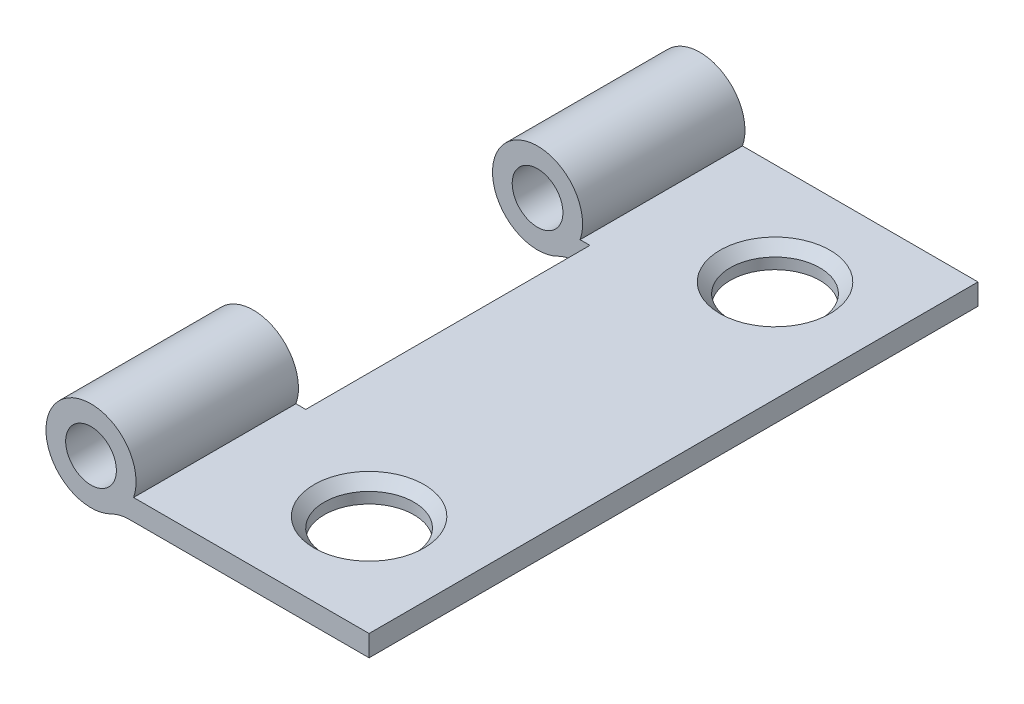
ISO-10303-21;
HEADER;
FILE_DESCRIPTION(('STEP AP214'),'2;1');
FILE_NAME('part.step','',(''),(''),'','','');
FILE_SCHEMA(('AUTOMOTIVE_DESIGN { 1 0 10303 214 1 1 1 1 }'));
ENDSEC;
DATA;
#1=APPLICATION_CONTEXT('core data for automotive mechanical design processes');
#2=APPLICATION_PROTOCOL_DEFINITION('international standard','automotive_design',2000,#1);
#3=PRODUCT_CONTEXT('',#1,'mechanical');
#4=PRODUCT('Part','Part','',(#3));
#5=PRODUCT_RELATED_PRODUCT_CATEGORY('part','',(#4));
#6=PRODUCT_DEFINITION_FORMATION('','',#4);
#7=PRODUCT_DEFINITION_CONTEXT('part definition',#1,'design');
#8=PRODUCT_DEFINITION('design','',#6,#7);
#9=PRODUCT_DEFINITION_SHAPE('','',#8);
#10=(LENGTH_UNIT() NAMED_UNIT(*) SI_UNIT(.MILLI.,.METRE.));
#11=(NAMED_UNIT(*) PLANE_ANGLE_UNIT() SI_UNIT($,.RADIAN.));
#12=(NAMED_UNIT(*) SI_UNIT($,.STERADIAN.) SOLID_ANGLE_UNIT());
#13=UNCERTAINTY_MEASURE_WITH_UNIT(LENGTH_MEASURE(1.E-05),#10,'distance_accuracy_value','');
#14=(GEOMETRIC_REPRESENTATION_CONTEXT(3) GLOBAL_UNCERTAINTY_ASSIGNED_CONTEXT((#13)) GLOBAL_UNIT_ASSIGNED_CONTEXT((#10,
#11,#12)) REPRESENTATION_CONTEXT('',''));
#15=CARTESIAN_POINT('',(0.,0.,0.));
#16=DIRECTION('',(0.,0.,1.));
#17=DIRECTION('',(1.,0.,0.));
#18=AXIS2_PLACEMENT_3D('',#15,#16,#17);
#19=CARTESIAN_POINT('',(0.,0.,19.05));
#20=DIRECTION('',(0.,0.,-1.));
#21=DIRECTION('',(-1.,0.,0.));
#22=AXIS2_PLACEMENT_3D('',#19,#20,#21);
#23=CYLINDRICAL_SURFACE('',#22,2.8194);
#24=CARTESIAN_POINT('',(0.,0.,8.89));
#25=DIRECTION('',(0.,0.,-1.));
#26=DIRECTION('',(-1.,0.,0.));
#27=AXIS2_PLACEMENT_3D('',#24,#25,#26);
#28=CIRCLE('',#27,2.8194);
#29=CARTESIAN_POINT('',(1.26684619394999,-2.51875308056872,8.89));
#30=VERTEX_POINT('',#29);
#31=CARTESIAN_POINT('',(2.66261186619455,-0.927100000000002,8.89));
#32=VERTEX_POINT('',#31);
#33=EDGE_CURVE('E135',#30,#32,#28,.T.);
#34=ORIENTED_EDGE('',*,*,#33,.F.);
#35=DIRECTION('',(0.,0.,-1.));
#36=VECTOR('',#35,1.);
#37=CARTESIAN_POINT('',(1.26684619394999,-2.51875308056872,19.05));
#38=LINE('',#37,#36);
#39=CARTESIAN_POINT('',(1.26684619394999,-2.51875308056872,19.05));
#40=VERTEX_POINT('',#39);
#41=EDGE_CURVE('E62',#30,#40,#38,.F.);
#42=ORIENTED_EDGE('',*,*,#41,.T.);
#43=CARTESIAN_POINT('',(0.,0.,19.05));
#44=DIRECTION('',(0.,0.,1.));
#45=DIRECTION('',(1.,0.,0.));
#46=AXIS2_PLACEMENT_3D('',#43,#44,#45);
#47=CIRCLE('',#46,2.8194);
#48=CARTESIAN_POINT('',(2.66261186619455,-0.9271,19.05));
#49=VERTEX_POINT('',#48);
#50=EDGE_CURVE('E189',#49,#40,#47,.T.);
#51=ORIENTED_EDGE('',*,*,#50,.F.);
#52=DIRECTION('',(0.,0.,-1.));
#53=VECTOR('',#52,1.);
#54=CARTESIAN_POINT('',(2.66261186619455,-0.927100000000002,34.8027168521072));
#55=LINE('',#54,#53);
#56=EDGE_CURVE('E176',#49,#32,#55,.T.);
#57=ORIENTED_EDGE('',*,*,#56,.T.);
#58=EDGE_LOOP('',(#34,#42,#51,#57));
#59=FACE_BOUND('',#58,.T.);
#60=ADVANCED_FACE('F37',(#59),#23,.T.);
#61=CARTESIAN_POINT('',(0.,0.,19.05));
#62=DIRECTION('',(0.,0.,-1.));
#63=DIRECTION('',(-1.,0.,0.));
#64=AXIS2_PLACEMENT_3D('',#61,#62,#63);
#65=CYLINDRICAL_SURFACE('',#64,1.5875);
#66=CARTESIAN_POINT('',(0.,0.,19.05));
#67=DIRECTION('',(0.,0.,1.));
#68=DIRECTION('',(1.,0.,0.));
#69=AXIS2_PLACEMENT_3D('',#66,#67,#68);
#70=CIRCLE('',#69,1.5875);
#71=CARTESIAN_POINT('',(-1.5875,0.,19.05));
#72=VERTEX_POINT('',#71);
#73=EDGE_CURVE('E183',#72,#72,#70,.T.);
#74=CARTESIAN_POINT('',(0.,0.,8.89));
#75=DIRECTION('',(0.,0.,-1.));
#76=DIRECTION('',(-1.,0.,0.));
#77=AXIS2_PLACEMENT_3D('',#74,#75,#76);
#78=CIRCLE('',#77,1.5875);
#79=CARTESIAN_POINT('',(-1.5875,0.,8.89));
#80=VERTEX_POINT('',#79);
#81=EDGE_CURVE('E141',#80,#80,#78,.T.);
#82=CARTESIAN_POINT('',(-1.5875,0.,19.05));
#83=CARTESIAN_POINT('',(-1.5875,0.,18.9441666666667));
#84=CARTESIAN_POINT('',(-1.5875,0.,18.8383333333333));
#85=CARTESIAN_POINT('',(-1.5875,0.,18.6266666666667));
#86=CARTESIAN_POINT('',(-1.5875,0.,18.5208333333333));
#87=CARTESIAN_POINT('',(-1.5875,0.,18.3091666666667));
#88=CARTESIAN_POINT('',(-1.5875,0.,18.2033333333333));
#89=CARTESIAN_POINT('',(-1.5875,0.,17.9916666666667));
#90=CARTESIAN_POINT('',(-1.5875,0.,17.8858333333333));
#91=CARTESIAN_POINT('',(-1.5875,0.,17.6741666666667));
#92=CARTESIAN_POINT('',(-1.5875,0.,17.5683333333333));
#93=CARTESIAN_POINT('',(-1.5875,0.,17.3566666666667));
#94=CARTESIAN_POINT('',(-1.5875,0.,17.2508333333333));
#95=CARTESIAN_POINT('',(-1.5875,0.,17.0391666666667));
#96=CARTESIAN_POINT('',(-1.5875,0.,16.9333333333333));
#97=CARTESIAN_POINT('',(-1.5875,0.,16.7216666666667));
#98=CARTESIAN_POINT('',(-1.5875,0.,16.6158333333333));
#99=CARTESIAN_POINT('',(-1.5875,0.,16.4041666666667));
#100=CARTESIAN_POINT('',(-1.5875,0.,16.2983333333333));
#101=CARTESIAN_POINT('',(-1.5875,0.,16.0866666666667));
#102=CARTESIAN_POINT('',(-1.5875,0.,15.9808333333333));
#103=CARTESIAN_POINT('',(-1.5875,0.,15.7691666666667));
#104=CARTESIAN_POINT('',(-1.5875,0.,15.6633333333333));
#105=CARTESIAN_POINT('',(-1.5875,0.,15.4516666666667));
#106=CARTESIAN_POINT('',(-1.5875,0.,15.3458333333333));
#107=CARTESIAN_POINT('',(-1.5875,0.,15.1341666666667));
#108=CARTESIAN_POINT('',(-1.5875,0.,15.0283333333333));
#109=CARTESIAN_POINT('',(-1.5875,0.,14.8166666666667));
#110=CARTESIAN_POINT('',(-1.5875,0.,14.7108333333333));
#111=CARTESIAN_POINT('',(-1.5875,0.,14.4991666666667));
#112=CARTESIAN_POINT('',(-1.5875,0.,14.3933333333333));
#113=CARTESIAN_POINT('',(-1.5875,0.,14.1816666666667));
#114=CARTESIAN_POINT('',(-1.5875,0.,14.0758333333333));
#115=CARTESIAN_POINT('',(-1.5875,0.,13.8641666666667));
#116=CARTESIAN_POINT('',(-1.5875,0.,13.7583333333333));
#117=CARTESIAN_POINT('',(-1.5875,0.,13.5466666666667));
#118=CARTESIAN_POINT('',(-1.5875,0.,13.4408333333333));
#119=CARTESIAN_POINT('',(-1.5875,0.,13.2291666666667));
#120=CARTESIAN_POINT('',(-1.5875,0.,13.1233333333333));
#121=CARTESIAN_POINT('',(-1.5875,0.,12.9116666666667));
#122=CARTESIAN_POINT('',(-1.5875,0.,12.8058333333333));
#123=CARTESIAN_POINT('',(-1.5875,0.,12.5941666666667));
#124=CARTESIAN_POINT('',(-1.5875,0.,12.4883333333333));
#125=CARTESIAN_POINT('',(-1.5875,0.,12.2766666666667));
#126=CARTESIAN_POINT('',(-1.5875,0.,12.1708333333333));
#127=CARTESIAN_POINT('',(-1.5875,0.,11.9591666666667));
#128=CARTESIAN_POINT('',(-1.5875,0.,11.8533333333333));
#129=CARTESIAN_POINT('',(-1.5875,0.,11.6416666666667));
#130=CARTESIAN_POINT('',(-1.5875,0.,11.5358333333333));
#131=CARTESIAN_POINT('',(-1.5875,0.,11.3241666666667));
#132=CARTESIAN_POINT('',(-1.5875,0.,11.2183333333333));
#133=CARTESIAN_POINT('',(-1.5875,0.,11.0066666666667));
#134=CARTESIAN_POINT('',(-1.5875,0.,10.9008333333333));
#135=CARTESIAN_POINT('',(-1.5875,0.,10.6891666666667));
#136=CARTESIAN_POINT('',(-1.5875,0.,10.5833333333333));
#137=CARTESIAN_POINT('',(-1.5875,0.,10.3716666666667));
#138=CARTESIAN_POINT('',(-1.5875,0.,10.2658333333333));
#139=CARTESIAN_POINT('',(-1.5875,0.,10.0541666666667));
#140=CARTESIAN_POINT('',(-1.5875,0.,9.94833333333333));
#141=CARTESIAN_POINT('',(-1.5875,0.,9.73666666666667));
#142=CARTESIAN_POINT('',(-1.5875,0.,9.63083333333333));
#143=CARTESIAN_POINT('',(-1.5875,0.,9.41916666666667));
#144=CARTESIAN_POINT('',(-1.5875,0.,9.31333333333333));
#145=CARTESIAN_POINT('',(-1.5875,0.,9.10166666666667));
#146=CARTESIAN_POINT('',(-1.5875,0.,8.99583333333333));
#147=CARTESIAN_POINT('',(-1.5875,0.,8.89));
#148=B_SPLINE_CURVE_WITH_KNOTS('',3,(#82,#83,#84,#85,#86,#87,#88,#89,#90,#91,#92,#93,#94,#95,
#96,#97,#98,#99,#100,#101,#102,#103,#104,#105,#106,#107,#108,#109,#110,#111,#112,#113,#114,#115,
#116,#117,#118,#119,#120,#121,#122,#123,#124,#125,#126,#127,#128,#129,#130,#131,#132,#133,#134,
#135,#136,#137,#138,#139,#140,#141,#142,#143,#144,#145,#146,#147),.UNSPECIFIED.,.F.,.F.,(4,2,2,
2,2,2,2,2,2,2,2,2,2,2,2,2,2,2,2,2,2,2,2,2,2,2,2,2,2,2,2,2,4),(0.,0.317499999999998,
0.634999999999997,0.952499999999998,1.27,1.5875,1.905,2.2225,2.54,2.8575,3.175,3.4925,3.81,
4.1275,4.445,4.7625,5.08,5.3975,5.715,6.0325,6.35,6.6675,6.985,7.3025,7.62,7.9375,8.255,8.5725,
8.89,9.2075,9.525,9.8425,10.16),.UNSPECIFIED.);
#149=EDGE_CURVE('BSEAM261',#72,#80,#148,.T.);
#150=ORIENTED_EDGE('',*,*,#73,.T.);
#151=ORIENTED_EDGE('',*,*,#81,.T.);
#152=ORIENTED_EDGE('',*,*,#149,.T.);
#153=ORIENTED_EDGE('',*,*,#149,.F.);
#154=EDGE_LOOP('',(#150,#152,#151,#153));
#155=FACE_BOUND('',#154,.T.);
#156=ADVANCED_FACE('F261',(#155),#65,.F.);
#157=CARTESIAN_POINT('',(2.40814907138242,-4.7879,19.05));
#158=DIRECTION('',(0.,0.,-1.));
#159=DIRECTION('',(-1.,0.,0.));
#160=AXIS2_PLACEMENT_3D('',#157,#158,#159);
#161=CYLINDRICAL_SURFACE('',#160,2.54);
#162=CARTESIAN_POINT('',(2.40814907138242,-4.7879,8.89));
#163=DIRECTION('',(0.,0.,-1.));
#164=DIRECTION('',(-1.,0.,0.));
#165=AXIS2_PLACEMENT_3D('',#162,#163,#164);
#166=CIRCLE('',#165,2.54);
#167=CARTESIAN_POINT('',(2.40814907138242,-2.2479,8.89));
#168=VERTEX_POINT('',#167);
#169=EDGE_CURVE('E202',#168,#30,#166,.F.);
#170=ORIENTED_EDGE('',*,*,#169,.F.);
#171=DIRECTION('',(0.,0.,1.));
#172=VECTOR('',#171,1.);
#173=CARTESIAN_POINT('',(2.40814907138242,-2.2479,-19.05));
#174=LINE('',#173,#172);
#175=CARTESIAN_POINT('',(2.40814907138242,-2.2479,19.05));
#176=VERTEX_POINT('',#175);
#177=EDGE_CURVE('E134',#176,#168,#174,.F.);
#178=ORIENTED_EDGE('',*,*,#177,.F.);
#179=CARTESIAN_POINT('',(2.40814907138242,-4.7879,19.05));
#180=DIRECTION('',(0.,0.,1.));
#181=DIRECTION('',(1.,0.,0.));
#182=AXIS2_PLACEMENT_3D('',#179,#180,#181);
#183=CIRCLE('',#182,2.54);
#184=EDGE_CURVE('E200',#40,#176,#183,.F.);
#185=ORIENTED_EDGE('',*,*,#184,.F.);
#186=ORIENTED_EDGE('',*,*,#41,.F.);
#187=EDGE_LOOP('',(#170,#178,#185,#186));
#188=FACE_BOUND('',#187,.T.);
#189=ADVANCED_FACE('F258',(#188),#161,.F.);
#190=CARTESIAN_POINT('',(1.26684619394999,-2.51875308056872,-19.05));
#191=VERTEX_POINT('',#190);
#192=CARTESIAN_POINT('',(1.26684619394999,-2.51875308056872,-8.89));
#193=VERTEX_POINT('',#192);
#194=EDGE_CURVE('E195',#191,#193,#38,.F.);
#195=ORIENTED_EDGE('',*,*,#194,.T.);
#196=CARTESIAN_POINT('',(0.,0.,-8.89));
#197=DIRECTION('',(0.,0.,-1.));
#198=DIRECTION('',(-1.,0.,0.));
#199=AXIS2_PLACEMENT_3D('',#196,#197,#198);
#200=CIRCLE('',#199,2.8194);
#201=CARTESIAN_POINT('',(2.66261186619455,-0.927100000000002,-8.89));
#202=VERTEX_POINT('',#201);
#203=EDGE_CURVE('E146',#193,#202,#200,.T.);
#204=ORIENTED_EDGE('',*,*,#203,.T.);
#205=CARTESIAN_POINT('',(2.66261186619455,-0.927100000000002,-19.05));
#206=VERTEX_POINT('',#205);
#207=EDGE_CURVE('E179',#202,#206,#55,.T.);
#208=ORIENTED_EDGE('',*,*,#207,.T.);
#209=CARTESIAN_POINT('',(0.,0.,-19.05));
#210=DIRECTION('',(0.,0.,1.));
#211=DIRECTION('',(1.,0.,0.));
#212=AXIS2_PLACEMENT_3D('',#209,#210,#211);
#213=CIRCLE('',#212,2.8194);
#214=EDGE_CURVE('E186',#206,#191,#213,.T.);
#215=ORIENTED_EDGE('',*,*,#214,.T.);
#216=EDGE_LOOP('',(#195,#204,#208,#215));
#217=FACE_BOUND('',#216,.T.);
#218=ADVANCED_FACE('F237',(#217),#23,.T.);
#219=CARTESIAN_POINT('',(0.,0.,19.05));
#220=DIRECTION('',(0.,0.,1.));
#221=DIRECTION('',(1.,0.,0.));
#222=AXIS2_PLACEMENT_3D('',#219,#220,#221);
#223=PLANE('',#222);
#224=ORIENTED_EDGE('',*,*,#50,.T.);
#225=ORIENTED_EDGE('',*,*,#184,.T.);
#226=DIRECTION('',(1.,0.,0.));
#227=VECTOR('',#226,1.);
#228=CARTESIAN_POINT('',(1.7017526112805,-2.2479,19.05));
#229=LINE('',#228,#227);
#230=CARTESIAN_POINT('',(17.399,-2.2479,19.05));
#231=VERTEX_POINT('',#230);
#232=EDGE_CURVE('E174',#176,#231,#229,.T.);
#233=ORIENTED_EDGE('',*,*,#232,.T.);
#234=DIRECTION('',(0.,1.,0.));
#235=VECTOR('',#234,1.);
#236=CARTESIAN_POINT('',(17.399,-0.9271,19.05));
#237=LINE('',#236,#235);
#238=CARTESIAN_POINT('',(17.399,-0.9271,19.05));
#239=VERTEX_POINT('',#238);
#240=EDGE_CURVE('E171',#231,#239,#237,.T.);
#241=ORIENTED_EDGE('',*,*,#240,.T.);
#242=DIRECTION('',(-1.,0.,0.));
#243=VECTOR('',#242,1.);
#244=CARTESIAN_POINT('',(2.66261186619455,-0.9271,19.05));
#245=LINE('',#244,#243);
#246=EDGE_CURVE('E167',#239,#49,#245,.T.);
#247=ORIENTED_EDGE('',*,*,#246,.T.);
#248=EDGE_LOOP('',(#224,#225,#233,#241,#247));
#249=FACE_BOUND('',#248,.T.);
#250=ORIENTED_EDGE('',*,*,#73,.F.);
#251=EDGE_LOOP('',(#250));
#252=FACE_BOUND('',#251,.T.);
#253=ADVANCED_FACE('F254',(#249,#252),#223,.T.);
#254=CARTESIAN_POINT('',(0.,0.,-19.05));
#255=DIRECTION('',(0.,0.,1.));
#256=DIRECTION('',(1.,0.,0.));
#257=AXIS2_PLACEMENT_3D('',#254,#255,#256);
#258=PLANE('',#257);
#259=ORIENTED_EDGE('',*,*,#214,.F.);
#260=DIRECTION('',(1.,0.,0.));
#261=VECTOR('',#260,1.);
#262=CARTESIAN_POINT('',(2.66261186619455,-0.9271,-19.05));
#263=LINE('',#262,#261);
#264=CARTESIAN_POINT('',(17.399,-0.9271,-19.05));
#265=VERTEX_POINT('',#264);
#266=EDGE_CURVE('E163',#206,#265,#263,.T.);
#267=ORIENTED_EDGE('',*,*,#266,.T.);
#268=DIRECTION('',(0.,-1.,0.));
#269=VECTOR('',#268,1.);
#270=CARTESIAN_POINT('',(17.399,-0.9271,-19.05));
#271=LINE('',#270,#269);
#272=CARTESIAN_POINT('',(17.399,-2.2479,-19.05));
#273=VERTEX_POINT('',#272);
#274=EDGE_CURVE('E160',#265,#273,#271,.T.);
#275=ORIENTED_EDGE('',*,*,#274,.T.);
#276=DIRECTION('',(-1.,0.,0.));
#277=VECTOR('',#276,1.);
#278=CARTESIAN_POINT('',(1.7017526112805,-2.2479,-19.05));
#279=LINE('',#278,#277);
#280=CARTESIAN_POINT('',(2.40814907138242,-2.2479,-19.05));
#281=VERTEX_POINT('',#280);
#282=EDGE_CURVE('E157',#273,#281,#279,.T.);
#283=ORIENTED_EDGE('',*,*,#282,.T.);
#284=CARTESIAN_POINT('',(2.40814907138242,-4.7879,-19.05));
#285=DIRECTION('',(0.,0.,1.));
#286=DIRECTION('',(1.,0.,0.));
#287=AXIS2_PLACEMENT_3D('',#284,#285,#286);
#288=CIRCLE('',#287,2.54);
#289=EDGE_CURVE('E198',#281,#191,#288,.T.);
#290=ORIENTED_EDGE('',*,*,#289,.T.);
#291=EDGE_LOOP('',(#259,#267,#275,#283,#290));
#292=FACE_BOUND('',#291,.T.);
#293=CARTESIAN_POINT('',(0.,0.,-19.05));
#294=DIRECTION('',(0.,0.,1.));
#295=DIRECTION('',(1.,0.,0.));
#296=AXIS2_PLACEMENT_3D('',#293,#294,#295);
#297=CIRCLE('',#296,1.5875);
#298=CARTESIAN_POINT('',(-1.5875,0.,-19.05));
#299=VERTEX_POINT('',#298);
#300=EDGE_CURVE('E170',#299,#299,#297,.T.);
#301=ORIENTED_EDGE('',*,*,#300,.T.);
#302=EDGE_LOOP('',(#301));
#303=FACE_BOUND('',#302,.T.);
#304=ADVANCED_FACE('F240',(#292,#303),#258,.F.);
#305=CARTESIAN_POINT('',(0.,0.,-8.89));
#306=DIRECTION('',(0.,0.,-1.));
#307=DIRECTION('',(-1.,0.,0.));
#308=AXIS2_PLACEMENT_3D('',#305,#306,#307);
#309=CIRCLE('',#308,1.5875);
#310=CARTESIAN_POINT('',(-1.5875,0.,-8.89));
#311=VERTEX_POINT('',#310);
#312=EDGE_CURVE('E152',#311,#311,#309,.T.);
#313=CARTESIAN_POINT('',(-1.5875,0.,-8.89));
#314=CARTESIAN_POINT('',(-1.5875,0.,-8.99583333333333));
#315=CARTESIAN_POINT('',(-1.5875,0.,-9.10166666666666));
#316=CARTESIAN_POINT('',(-1.5875,0.,-9.31333333333333));
#317=CARTESIAN_POINT('',(-1.5875,0.,-9.41916666666666));
#318=CARTESIAN_POINT('',(-1.5875,0.,-9.63083333333333));
#319=CARTESIAN_POINT('',(-1.5875,0.,-9.73666666666666));
#320=CARTESIAN_POINT('',(-1.5875,0.,-9.94833333333333));
#321=CARTESIAN_POINT('',(-1.5875,0.,-10.0541666666667));
#322=CARTESIAN_POINT('',(-1.5875,0.,-10.2658333333333));
#323=CARTESIAN_POINT('',(-1.5875,0.,-10.3716666666667));
#324=CARTESIAN_POINT('',(-1.5875,0.,-10.5833333333333));
#325=CARTESIAN_POINT('',(-1.5875,0.,-10.6891666666667));
#326=CARTESIAN_POINT('',(-1.5875,0.,-10.9008333333333));
#327=CARTESIAN_POINT('',(-1.5875,0.,-11.0066666666667));
#328=CARTESIAN_POINT('',(-1.5875,0.,-11.2183333333333));
#329=CARTESIAN_POINT('',(-1.5875,0.,-11.3241666666667));
#330=CARTESIAN_POINT('',(-1.5875,0.,-11.5358333333333));
#331=CARTESIAN_POINT('',(-1.5875,0.,-11.6416666666667));
#332=CARTESIAN_POINT('',(-1.5875,0.,-11.8533333333333));
#333=CARTESIAN_POINT('',(-1.5875,0.,-11.9591666666667));
#334=CARTESIAN_POINT('',(-1.5875,0.,-12.1708333333333));
#335=CARTESIAN_POINT('',(-1.5875,0.,-12.2766666666667));
#336=CARTESIAN_POINT('',(-1.5875,0.,-12.4883333333333));
#337=CARTESIAN_POINT('',(-1.5875,0.,-12.5941666666667));
#338=CARTESIAN_POINT('',(-1.5875,0.,-12.8058333333333));
#339=CARTESIAN_POINT('',(-1.5875,0.,-12.9116666666667));
#340=CARTESIAN_POINT('',(-1.5875,0.,-13.1233333333333));
#341=CARTESIAN_POINT('',(-1.5875,0.,-13.2291666666667));
#342=CARTESIAN_POINT('',(-1.5875,0.,-13.4408333333333));
#343=CARTESIAN_POINT('',(-1.5875,0.,-13.5466666666667));
#344=CARTESIAN_POINT('',(-1.5875,0.,-13.7583333333333));
#345=CARTESIAN_POINT('',(-1.5875,0.,-13.8641666666667));
#346=CARTESIAN_POINT('',(-1.5875,0.,-14.0758333333333));
#347=CARTESIAN_POINT('',(-1.5875,0.,-14.1816666666667));
#348=CARTESIAN_POINT('',(-1.5875,0.,-14.3933333333333));
#349=CARTESIAN_POINT('',(-1.5875,0.,-14.4991666666667));
#350=CARTESIAN_POINT('',(-1.5875,0.,-14.7108333333333));
#351=CARTESIAN_POINT('',(-1.5875,0.,-14.8166666666667));
#352=CARTESIAN_POINT('',(-1.5875,0.,-15.0283333333333));
#353=CARTESIAN_POINT('',(-1.5875,0.,-15.1341666666667));
#354=CARTESIAN_POINT('',(-1.5875,0.,-15.3458333333333));
#355=CARTESIAN_POINT('',(-1.5875,0.,-15.4516666666667));
#356=CARTESIAN_POINT('',(-1.5875,0.,-15.6633333333333));
#357=CARTESIAN_POINT('',(-1.5875,0.,-15.7691666666667));
#358=CARTESIAN_POINT('',(-1.5875,0.,-15.9808333333333));
#359=CARTESIAN_POINT('',(-1.5875,0.,-16.0866666666667));
#360=CARTESIAN_POINT('',(-1.5875,0.,-16.2983333333333));
#361=CARTESIAN_POINT('',(-1.5875,0.,-16.4041666666667));
#362=CARTESIAN_POINT('',(-1.5875,0.,-16.6158333333333));
#363=CARTESIAN_POINT('',(-1.5875,0.,-16.7216666666667));
#364=CARTESIAN_POINT('',(-1.5875,0.,-16.9333333333333));
#365=CARTESIAN_POINT('',(-1.5875,0.,-17.0391666666667));
#366=CARTESIAN_POINT('',(-1.5875,0.,-17.2508333333333));
#367=CARTESIAN_POINT('',(-1.5875,0.,-17.3566666666667));
#368=CARTESIAN_POINT('',(-1.5875,0.,-17.5683333333333));
#369=CARTESIAN_POINT('',(-1.5875,0.,-17.6741666666667));
#370=CARTESIAN_POINT('',(-1.5875,0.,-17.8858333333333));
#371=CARTESIAN_POINT('',(-1.5875,0.,-17.9916666666667));
#372=CARTESIAN_POINT('',(-1.5875,0.,-18.2033333333333));
#373=CARTESIAN_POINT('',(-1.5875,0.,-18.3091666666667));
#374=CARTESIAN_POINT('',(-1.5875,0.,-18.5208333333333));
#375=CARTESIAN_POINT('',(-1.5875,0.,-18.6266666666667));
#376=CARTESIAN_POINT('',(-1.5875,0.,-18.8383333333333));
#377=CARTESIAN_POINT('',(-1.5875,0.,-18.9441666666667));
#378=CARTESIAN_POINT('',(-1.5875,0.,-19.05));
#379=B_SPLINE_CURVE_WITH_KNOTS('',3,(#313,#314,#315,#316,#317,#318,#319,#320,#321,#322,#323,
#324,#325,#326,#327,#328,#329,#330,#331,#332,#333,#334,#335,#336,#337,#338,#339,#340,#341,#342,
#343,#344,#345,#346,#347,#348,#349,#350,#351,#352,#353,#354,#355,#356,#357,#358,#359,#360,#361,
#362,#363,#364,#365,#366,#367,#368,#369,#370,#371,#372,#373,#374,#375,#376,#377,#378),
.UNSPECIFIED.,.F.,.F.,(4,2,2,2,2,2,2,2,2,2,2,2,2,2,2,2,2,2,2,2,2,2,2,2,2,2,2,2,2,2,2,2,4),(0.,
0.317500000000002,0.635,0.952500000000002,1.27,1.5875,1.905,2.2225,2.54,2.8575,3.175,3.4925,
3.81,4.1275,4.445,4.7625,5.08,5.3975,5.715,6.0325,6.35,6.6675,6.985,7.30250000000001,
7.62000000000001,7.9375,8.255,8.5725,8.89000000000001,9.2075,9.52500000000001,9.84250000000001,
10.16),.UNSPECIFIED.);
#380=EDGE_CURVE('BSEAM267',#311,#299,#379,.T.);
#381=ORIENTED_EDGE('',*,*,#312,.F.);
#382=ORIENTED_EDGE('',*,*,#300,.F.);
#383=ORIENTED_EDGE('',*,*,#380,.T.);
#384=ORIENTED_EDGE('',*,*,#380,.F.);
#385=EDGE_LOOP('',(#381,#383,#382,#384));
#386=FACE_BOUND('',#385,.T.);
#387=ADVANCED_FACE('F267',(#386),#65,.F.);
#388=CARTESIAN_POINT('',(17.399,-0.9271,34.8027168521072));
#389=DIRECTION('',(-1.,0.,0.));
#390=DIRECTION('',(0.,0.,1.));
#391=AXIS2_PLACEMENT_3D('',#388,#389,#390);
#392=PLANE('',#391);
#393=ORIENTED_EDGE('',*,*,#240,.F.);
#394=DIRECTION('',(0.,0.,-1.));
#395=VECTOR('',#394,1.);
#396=CARTESIAN_POINT('',(17.399,-2.2479,34.8027168521072));
#397=LINE('',#396,#395);
#398=EDGE_CURVE('E166',#231,#273,#397,.T.);
#399=ORIENTED_EDGE('',*,*,#398,.T.);
#400=ORIENTED_EDGE('',*,*,#274,.F.);
#401=DIRECTION('',(0.,0.,-1.));
#402=VECTOR('',#401,1.);
#403=CARTESIAN_POINT('',(17.399,-0.9271,34.8027168521072));
#404=LINE('',#403,#402);
#405=EDGE_CURVE('E177',#239,#265,#404,.T.);
#406=ORIENTED_EDGE('',*,*,#405,.F.);
#407=EDGE_LOOP('',(#393,#399,#400,#406));
#408=FACE_BOUND('',#407,.T.);
#409=ADVANCED_FACE('F229',(#408),#392,.F.);
#410=CARTESIAN_POINT('',(2.66261186619455,-0.9271,34.8027168521072));
#411=DIRECTION('',(0.,-1.,0.));
#412=DIRECTION('',(1.,0.,0.));
#413=AXIS2_PLACEMENT_3D('',#410,#411,#412);
#414=PLANE('',#413);
#415=CARTESIAN_POINT('',(11.049,-0.927099999999998,-12.7));
#416=DIRECTION('',(0.,1.,0.));
#417=DIRECTION('',(0.,0.,1.));
#418=AXIS2_PLACEMENT_3D('',#415,#416,#417);
#419=CIRCLE('',#418,3.4417);
#420=CARTESIAN_POINT('',(11.049,-0.927099999999998,-9.2583));
#421=VERTEX_POINT('',#420);
#422=EDGE_CURVE('E220',#421,#421,#419,.T.);
#423=ORIENTED_EDGE('',*,*,#422,.F.);
#424=EDGE_LOOP('',(#423));
#425=FACE_BOUND('',#424,.T.);
#426=CARTESIAN_POINT('',(11.049,-0.927099999999998,12.7));
#427=DIRECTION('',(0.,1.,0.));
#428=DIRECTION('',(0.,0.,1.));
#429=AXIS2_PLACEMENT_3D('',#426,#427,#428);
#430=CIRCLE('',#429,3.4417);
#431=CARTESIAN_POINT('',(11.049,-0.927099999999998,16.1417));
#432=VERTEX_POINT('',#431);
#433=EDGE_CURVE('E210',#432,#432,#430,.T.);
#434=ORIENTED_EDGE('',*,*,#433,.F.);
#435=EDGE_LOOP('',(#434));
#436=FACE_BOUND('',#435,.T.);
#437=ORIENTED_EDGE('',*,*,#207,.F.);
#438=DIRECTION('',(1.,0.,0.));
#439=VECTOR('',#438,1.);
#440=CARTESIAN_POINT('',(2.66261186619455,-0.9271,-8.89));
#441=LINE('',#440,#439);
#442=CARTESIAN_POINT('',(3.2766,-0.927100000000001,-8.89));
#443=VERTEX_POINT('',#442);
#444=EDGE_CURVE('E149',#202,#443,#441,.T.);
#445=ORIENTED_EDGE('',*,*,#444,.T.);
#446=DIRECTION('',(0.,0.,1.));
#447=VECTOR('',#446,1.);
#448=CARTESIAN_POINT('',(3.2766,-0.9271,34.8027168521072));
#449=LINE('',#448,#447);
#450=CARTESIAN_POINT('',(3.2766,-0.927100000000001,8.89));
#451=VERTEX_POINT('',#450);
#452=EDGE_CURVE('E155',#443,#451,#449,.T.);
#453=ORIENTED_EDGE('',*,*,#452,.T.);
#454=DIRECTION('',(1.,0.,0.));
#455=VECTOR('',#454,1.);
#456=CARTESIAN_POINT('',(2.66261186619455,-0.9271,8.89));
#457=LINE('',#456,#455);
#458=EDGE_CURVE('E127',#32,#451,#457,.T.);
#459=ORIENTED_EDGE('',*,*,#458,.F.);
#460=ORIENTED_EDGE('',*,*,#56,.F.);
#461=ORIENTED_EDGE('',*,*,#246,.F.);
#462=ORIENTED_EDGE('',*,*,#405,.T.);
#463=ORIENTED_EDGE('',*,*,#266,.F.);
#464=EDGE_LOOP('',(#437,#445,#453,#459,#460,#461,#462,#463));
#465=FACE_BOUND('',#464,.T.);
#466=ADVANCED_FACE('F226',(#425,#436,#465),#414,.F.);
#467=CARTESIAN_POINT('',(1.7017526112805,-2.2479,34.8027168521072));
#468=DIRECTION('',(0.,1.,0.));
#469=DIRECTION('',(0.,0.,1.));
#470=AXIS2_PLACEMENT_3D('',#467,#468,#469);
#471=PLANE('',#470);
#472=CARTESIAN_POINT('',(11.049,-2.2479,-12.7));
#473=DIRECTION('',(0.,1.,0.));
#474=DIRECTION('',(0.,0.,1.));
#475=AXIS2_PLACEMENT_3D('',#472,#473,#474);
#476=CIRCLE('',#475,2.8067);
#477=CARTESIAN_POINT('',(11.049,-2.2479,-9.89330000000001));
#478=VERTEX_POINT('',#477);
#479=EDGE_CURVE('E41',#478,#478,#476,.T.);
#480=ORIENTED_EDGE('',*,*,#479,.T.);
#481=EDGE_LOOP('',(#480));
#482=FACE_BOUND('',#481,.T.);
#483=CARTESIAN_POINT('',(11.049,-2.2479,12.7));
#484=DIRECTION('',(0.,1.,0.));
#485=DIRECTION('',(0.,0.,1.));
#486=AXIS2_PLACEMENT_3D('',#483,#484,#485);
#487=CIRCLE('',#486,2.8067);
#488=CARTESIAN_POINT('',(11.049,-2.2479,15.5067));
#489=VERTEX_POINT('',#488);
#490=EDGE_CURVE('E128',#489,#489,#487,.T.);
#491=ORIENTED_EDGE('',*,*,#490,.T.);
#492=EDGE_LOOP('',(#491));
#493=FACE_BOUND('',#492,.T.);
#494=DIRECTION('',(0.,0.,-1.));
#495=VECTOR('',#494,1.);
#496=CARTESIAN_POINT('',(3.2766,-2.2479,34.8027168521072));
#497=LINE('',#496,#495);
#498=CARTESIAN_POINT('',(3.2766,-2.2479,8.89));
#499=VERTEX_POINT('',#498);
#500=CARTESIAN_POINT('',(3.2766,-2.2479,-8.89));
#501=VERTEX_POINT('',#500);
#502=EDGE_CURVE('E11',#499,#501,#497,.T.);
#503=ORIENTED_EDGE('',*,*,#502,.T.);
#504=DIRECTION('',(-1.,0.,0.));
#505=VECTOR('',#504,1.);
#506=CARTESIAN_POINT('',(1.7017526112805,-2.2479,-8.89));
#507=LINE('',#506,#505);
#508=CARTESIAN_POINT('',(2.40814907138242,-2.2479,-8.89));
#509=VERTEX_POINT('',#508);
#510=EDGE_CURVE('E144',#501,#509,#507,.T.);
#511=ORIENTED_EDGE('',*,*,#510,.T.);
#512=EDGE_CURVE('E191',#509,#281,#174,.F.);
#513=ORIENTED_EDGE('',*,*,#512,.T.);
#514=ORIENTED_EDGE('',*,*,#282,.F.);
#515=ORIENTED_EDGE('',*,*,#398,.F.);
#516=ORIENTED_EDGE('',*,*,#232,.F.);
#517=ORIENTED_EDGE('',*,*,#177,.T.);
#518=DIRECTION('',(-1.,0.,0.));
#519=VECTOR('',#518,1.);
#520=CARTESIAN_POINT('',(1.7017526112805,-2.2479,8.89));
#521=LINE('',#520,#519);
#522=EDGE_CURVE('E54',#499,#168,#521,.T.);
#523=ORIENTED_EDGE('',*,*,#522,.F.);
#524=EDGE_LOOP('',(#503,#511,#513,#514,#515,#516,#517,#523));
#525=FACE_BOUND('',#524,.T.);
#526=ADVANCED_FACE('F131',(#482,#493,#525),#471,.F.);
#527=ORIENTED_EDGE('',*,*,#512,.F.);
#528=CARTESIAN_POINT('',(2.40814907138242,-4.7879,-8.89));
#529=DIRECTION('',(0.,0.,-1.));
#530=DIRECTION('',(-1.,0.,0.));
#531=AXIS2_PLACEMENT_3D('',#528,#529,#530);
#532=CIRCLE('',#531,2.54);
#533=EDGE_CURVE('E46',#509,#193,#532,.F.);
#534=ORIENTED_EDGE('',*,*,#533,.T.);
#535=ORIENTED_EDGE('',*,*,#194,.F.);
#536=ORIENTED_EDGE('',*,*,#289,.F.);
#537=EDGE_LOOP('',(#527,#534,#535,#536));
#538=FACE_BOUND('',#537,.T.);
#539=ADVANCED_FACE('F39',(#538),#161,.F.);
#540=CARTESIAN_POINT('',(3.2766,-3.2766,-8.89));
#541=DIRECTION('',(1.,0.,0.));
#542=DIRECTION('',(0.,0.,-1.));
#543=AXIS2_PLACEMENT_3D('',#540,#541,#542);
#544=PLANE('',#543);
#545=DIRECTION('',(0.,1.,0.));
#546=VECTOR('',#545,1.);
#547=CARTESIAN_POINT('',(3.2766,-3.2766,-8.89));
#548=LINE('',#547,#546);
#549=EDGE_CURVE('E122',#501,#443,#548,.T.);
#550=ORIENTED_EDGE('',*,*,#549,.F.);
#551=ORIENTED_EDGE('',*,*,#502,.F.);
#552=DIRECTION('',(0.,1.,0.));
#553=VECTOR('',#552,1.);
#554=CARTESIAN_POINT('',(3.2766,-3.2766,8.89));
#555=LINE('',#554,#553);
#556=EDGE_CURVE('E119',#499,#451,#555,.T.);
#557=ORIENTED_EDGE('',*,*,#556,.T.);
#558=ORIENTED_EDGE('',*,*,#452,.F.);
#559=EDGE_LOOP('',(#550,#551,#557,#558));
#560=FACE_BOUND('',#559,.T.);
#561=ADVANCED_FACE('F118',(#560),#544,.F.);
#562=CARTESIAN_POINT('',(0.,0.,-8.89));
#563=DIRECTION('',(0.,0.,-1.));
#564=DIRECTION('',(-1.,0.,0.));
#565=AXIS2_PLACEMENT_3D('',#562,#563,#564);
#566=PLANE('',#565);
#567=ORIENTED_EDGE('',*,*,#312,.T.);
#568=EDGE_LOOP('',(#567));
#569=FACE_BOUND('',#568,.T.);
#570=ORIENTED_EDGE('',*,*,#203,.F.);
#571=ORIENTED_EDGE('',*,*,#533,.F.);
#572=ORIENTED_EDGE('',*,*,#510,.F.);
#573=ORIENTED_EDGE('',*,*,#549,.T.);
#574=ORIENTED_EDGE('',*,*,#444,.F.);
#575=EDGE_LOOP('',(#570,#571,#572,#573,#574));
#576=FACE_BOUND('',#575,.T.);
#577=ADVANCED_FACE('F248',(#569,#576),#566,.F.);
#578=CARTESIAN_POINT('',(0.,0.,8.89));
#579=DIRECTION('',(0.,0.,-1.));
#580=DIRECTION('',(-1.,0.,0.));
#581=AXIS2_PLACEMENT_3D('',#578,#579,#580);
#582=PLANE('',#581);
#583=ORIENTED_EDGE('',*,*,#81,.F.);
#584=EDGE_LOOP('',(#583));
#585=FACE_BOUND('',#584,.T.);
#586=ORIENTED_EDGE('',*,*,#458,.T.);
#587=ORIENTED_EDGE('',*,*,#556,.F.);
#588=ORIENTED_EDGE('',*,*,#522,.T.);
#589=ORIENTED_EDGE('',*,*,#169,.T.);
#590=ORIENTED_EDGE('',*,*,#33,.T.);
#591=EDGE_LOOP('',(#586,#587,#588,#589,#590));
#592=FACE_BOUND('',#591,.T.);
#593=ADVANCED_FACE('F125',(#585,#592),#582,.T.);
#594=CARTESIAN_POINT('',(11.049,-0.9271,12.7));
#595=DIRECTION('',(0.,1.,0.));
#596=DIRECTION('',(0.,0.,1.));
#597=AXIS2_PLACEMENT_3D('',#594,#595,#596);
#598=CYLINDRICAL_SURFACE('',#597,2.8067);
#599=CARTESIAN_POINT('',(11.049,-1.5621,12.7));
#600=DIRECTION('',(0.,1.,0.));
#601=DIRECTION('',(0.,0.,1.));
#602=AXIS2_PLACEMENT_3D('',#599,#600,#601);
#603=CIRCLE('',#602,2.8067);
#604=CARTESIAN_POINT('',(11.049,-1.5621,15.5067));
#605=VERTEX_POINT('',#604);
#606=EDGE_CURVE('E206',#605,#605,#603,.T.);
#607=ORIENTED_EDGE('',*,*,#606,.T.);
#608=EDGE_LOOP('',(#607));
#609=FACE_BOUND('',#608,.T.);
#610=ORIENTED_EDGE('',*,*,#490,.F.);
#611=EDGE_LOOP('',(#610));
#612=FACE_BOUND('',#611,.T.);
#613=ADVANCED_FACE('F327',(#609,#612),#598,.F.);
#614=CARTESIAN_POINT('',(11.049,-0.927099999999998,12.7));
#615=DIRECTION('',(0.,1.,0.));
#616=DIRECTION('',(0.,0.,1.));
#617=AXIS2_PLACEMENT_3D('',#614,#615,#616);
#618=CONICAL_SURFACE('',#617,3.4417,0.785398163397448);
#619=ORIENTED_EDGE('',*,*,#606,.F.);
#620=EDGE_LOOP('',(#619));
#621=FACE_BOUND('',#620,.T.);
#622=ORIENTED_EDGE('',*,*,#433,.T.);
#623=EDGE_LOOP('',(#622));
#624=FACE_BOUND('',#623,.T.);
#625=ADVANCED_FACE('F332',(#621,#624),#618,.F.);
#626=CARTESIAN_POINT('',(11.049,-0.9271,-12.7));
#627=DIRECTION('',(0.,1.,0.));
#628=DIRECTION('',(0.,0.,1.));
#629=AXIS2_PLACEMENT_3D('',#626,#627,#628);
#630=CYLINDRICAL_SURFACE('',#629,2.8067);
#631=CARTESIAN_POINT('',(11.049,-1.5621,-12.7));
#632=DIRECTION('',(0.,1.,0.));
#633=DIRECTION('',(0.,0.,1.));
#634=AXIS2_PLACEMENT_3D('',#631,#632,#633);
#635=CIRCLE('',#634,2.8067);
#636=CARTESIAN_POINT('',(11.049,-1.5621,-9.89330000000001));
#637=VERTEX_POINT('',#636);
#638=EDGE_CURVE('E217',#637,#637,#635,.T.);
#639=ORIENTED_EDGE('',*,*,#638,.T.);
#640=EDGE_LOOP('',(#639));
#641=FACE_BOUND('',#640,.T.);
#642=ORIENTED_EDGE('',*,*,#479,.F.);
#643=EDGE_LOOP('',(#642));
#644=FACE_BOUND('',#643,.T.);
#645=ADVANCED_FACE('F342',(#641,#644),#630,.F.);
#646=CARTESIAN_POINT('',(11.049,-0.927099999999998,-12.7));
#647=DIRECTION('',(0.,1.,0.));
#648=DIRECTION('',(0.,0.,1.));
#649=AXIS2_PLACEMENT_3D('',#646,#647,#648);
#650=CONICAL_SURFACE('',#649,3.4417,0.785398163397448);
#651=ORIENTED_EDGE('',*,*,#638,.F.);
#652=EDGE_LOOP('',(#651));
#653=FACE_BOUND('',#652,.T.);
#654=ORIENTED_EDGE('',*,*,#422,.T.);
#655=EDGE_LOOP('',(#654));
#656=FACE_BOUND('',#655,.T.);
#657=ADVANCED_FACE('F224',(#653,#656),#650,.F.);
#658=CLOSED_SHELL('',(#60,#156,#189,#218,#253,#304,#387,#409,#466,#526,#539,#561,#577,#593,#613,
#625,#645,#657));
#659=MANIFOLD_SOLID_BREP('B2',#658);
#660=ADVANCED_BREP_SHAPE_REPRESENTATION('',(#18,#659),#14);
#661=SHAPE_DEFINITION_REPRESENTATION(#9,#660);
ENDSEC;
END-ISO-10303-21;
